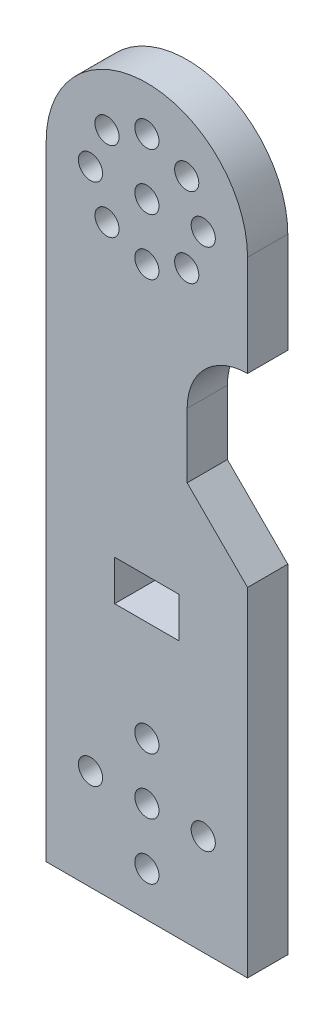
ISO-10303-21;
HEADER;
FILE_DESCRIPTION(('STEP AP214'),'2;1');
FILE_NAME('part.step','',(''),(''),'','','');
FILE_SCHEMA(('AUTOMOTIVE_DESIGN { 1 0 10303 214 1 1 1 1 }'));
ENDSEC;
DATA;
#1=APPLICATION_CONTEXT('core data for automotive mechanical design processes');
#2=APPLICATION_PROTOCOL_DEFINITION('international standard','automotive_design',2000,#1);
#3=PRODUCT_CONTEXT('',#1,'mechanical');
#4=PRODUCT('Part','Part','',(#3));
#5=PRODUCT_RELATED_PRODUCT_CATEGORY('part','',(#4));
#6=PRODUCT_DEFINITION_FORMATION('','',#4);
#7=PRODUCT_DEFINITION_CONTEXT('part definition',#1,'design');
#8=PRODUCT_DEFINITION('design','',#6,#7);
#9=PRODUCT_DEFINITION_SHAPE('','',#8);
#10=(LENGTH_UNIT() NAMED_UNIT(*) SI_UNIT(.MILLI.,.METRE.));
#11=(NAMED_UNIT(*) PLANE_ANGLE_UNIT() SI_UNIT($,.RADIAN.));
#12=(NAMED_UNIT(*) SI_UNIT($,.STERADIAN.) SOLID_ANGLE_UNIT());
#13=UNCERTAINTY_MEASURE_WITH_UNIT(LENGTH_MEASURE(1.E-05),#10,'distance_accuracy_value','');
#14=(GEOMETRIC_REPRESENTATION_CONTEXT(3) GLOBAL_UNCERTAINTY_ASSIGNED_CONTEXT((#13)) GLOBAL_UNIT_ASSIGNED_CONTEXT((#10,
#11,#12)) REPRESENTATION_CONTEXT('',''));
#15=CARTESIAN_POINT('',(0.,0.,0.));
#16=DIRECTION('',(0.,0.,1.));
#17=DIRECTION('',(1.,0.,0.));
#18=AXIS2_PLACEMENT_3D('',#15,#16,#17);
#19=CARTESIAN_POINT('',(12.5,0.,5.));
#20=DIRECTION('',(1.,0.,0.));
#21=DIRECTION('',(0.,1.,0.));
#22=AXIS2_PLACEMENT_3D('',#19,#20,#21);
#23=PLANE('',#22);
#24=DIRECTION('',(0.,0.,1.));
#25=VECTOR('',#24,1.);
#26=CARTESIAN_POINT('',(12.5,-12.5,-5.));
#27=LINE('',#26,#25);
#28=CARTESIAN_POINT('',(12.5,-12.5,0.));
#29=VERTEX_POINT('',#28);
#30=CARTESIAN_POINT('',(12.5,-12.5,5.));
#31=VERTEX_POINT('',#30);
#32=EDGE_CURVE('E146',#29,#31,#27,.T.);
#33=ORIENTED_EDGE('',*,*,#32,.F.);
#34=DIRECTION('',(0.,-1.,0.));
#35=VECTOR('',#34,1.);
#36=CARTESIAN_POINT('',(12.5,0.,0.));
#37=LINE('',#36,#35);
#38=CARTESIAN_POINT('',(12.5,0.,0.));
#39=VERTEX_POINT('',#38);
#40=EDGE_CURVE('E196',#39,#29,#37,.T.);
#41=ORIENTED_EDGE('',*,*,#40,.F.);
#42=DIRECTION('',(0.,0.,-1.));
#43=VECTOR('',#42,1.);
#44=CARTESIAN_POINT('',(12.5,0.,5.));
#45=LINE('',#44,#43);
#46=CARTESIAN_POINT('',(12.5,0.,5.));
#47=VERTEX_POINT('',#46);
#48=EDGE_CURVE('E216',#47,#39,#45,.T.);
#49=ORIENTED_EDGE('',*,*,#48,.F.);
#50=DIRECTION('',(0.,-1.,0.));
#51=VECTOR('',#50,1.);
#52=CARTESIAN_POINT('',(12.5,0.,5.));
#53=LINE('',#52,#51);
#54=EDGE_CURVE('E152',#47,#31,#53,.T.);
#55=ORIENTED_EDGE('',*,*,#54,.T.);
#56=EDGE_LOOP('',(#33,#41,#49,#55));
#57=FACE_BOUND('',#56,.T.);
#58=ADVANCED_FACE('F37',(#57),#23,.T.);
#59=CARTESIAN_POINT('',(0.,0.,5.));
#60=DIRECTION('',(0.,0.,1.));
#61=DIRECTION('',(1.,0.,0.));
#62=AXIS2_PLACEMENT_3D('',#59,#60,#61);
#63=PLANE('',#62);
#64=DIRECTION('',(0.707106781186549,-0.707106781186546,0.));
#65=VECTOR('',#64,1.);
#66=CARTESIAN_POINT('',(5.,-28.,5.));
#67=LINE('',#66,#65);
#68=CARTESIAN_POINT('',(5.,-28.,5.));
#69=VERTEX_POINT('',#68);
#70=CARTESIAN_POINT('',(12.5,-35.5,5.));
#71=VERTEX_POINT('',#70);
#72=EDGE_CURVE('E127',#69,#71,#67,.T.);
#73=ORIENTED_EDGE('',*,*,#72,.F.);
#74=DIRECTION('',(0.,-1.,0.));
#75=VECTOR('',#74,1.);
#76=CARTESIAN_POINT('',(5.,-20.,5.));
#77=LINE('',#76,#75);
#78=CARTESIAN_POINT('',(5.,-20.,5.));
#79=VERTEX_POINT('',#78);
#80=EDGE_CURVE('E137',#79,#69,#77,.T.);
#81=ORIENTED_EDGE('',*,*,#80,.F.);
#82=CARTESIAN_POINT('',(12.5,-20.,5.));
#83=DIRECTION('',(0.,0.,1.));
#84=DIRECTION('',(1.,0.,0.));
#85=AXIS2_PLACEMENT_3D('',#82,#83,#84);
#86=CIRCLE('',#85,7.5);
#87=EDGE_CURVE('E249',#31,#79,#86,.T.);
#88=ORIENTED_EDGE('',*,*,#87,.F.);
#89=ORIENTED_EDGE('',*,*,#54,.F.);
#90=CARTESIAN_POINT('',(0.,0.,5.));
#91=DIRECTION('',(0.,0.,1.));
#92=DIRECTION('',(1.,0.,0.));
#93=AXIS2_PLACEMENT_3D('',#90,#91,#92);
#94=CIRCLE('',#93,12.5);
#95=CARTESIAN_POINT('',(-12.5,0.,5.));
#96=VERTEX_POINT('',#95);
#97=EDGE_CURVE('E156',#47,#96,#94,.T.);
#98=ORIENTED_EDGE('',*,*,#97,.T.);
#99=DIRECTION('',(0.,-1.,0.));
#100=VECTOR('',#99,1.);
#101=CARTESIAN_POINT('',(-12.5,0.,5.));
#102=LINE('',#101,#100);
#103=CARTESIAN_POINT('',(-12.5,-77.5,5.));
#104=VERTEX_POINT('',#103);
#105=EDGE_CURVE('E164',#96,#104,#102,.T.);
#106=ORIENTED_EDGE('',*,*,#105,.T.);
#107=DIRECTION('',(1.,0.,0.));
#108=VECTOR('',#107,1.);
#109=CARTESIAN_POINT('',(0.,-77.5,5.));
#110=LINE('',#109,#108);
#111=CARTESIAN_POINT('',(12.5,-77.5,5.));
#112=VERTEX_POINT('',#111);
#113=EDGE_CURVE('E150',#104,#112,#110,.T.);
#114=ORIENTED_EDGE('',*,*,#113,.T.);
#115=EDGE_CURVE('E143',#71,#112,#53,.T.);
#116=ORIENTED_EDGE('',*,*,#115,.F.);
#117=EDGE_LOOP('',(#73,#81,#88,#89,#98,#106,#114,#116));
#118=FACE_BOUND('',#117,.T.);
#119=CARTESIAN_POINT('',(0.,-72.,5.));
#120=DIRECTION('',(0.,0.,-1.));
#121=DIRECTION('',(-1.,0.,0.));
#122=AXIS2_PLACEMENT_3D('',#119,#120,#121);
#123=CIRCLE('',#122,1.5);
#124=CARTESIAN_POINT('',(-1.5,-72.,5.));
#125=VERTEX_POINT('',#124);
#126=EDGE_CURVE('E234',#125,#125,#123,.T.);
#127=ORIENTED_EDGE('',*,*,#126,.T.);
#128=EDGE_LOOP('',(#127));
#129=FACE_BOUND('',#128,.T.);
#130=CARTESIAN_POINT('',(-7.,-65.,5.));
#131=DIRECTION('',(0.,0.,-1.));
#132=DIRECTION('',(-1.,0.,0.));
#133=AXIS2_PLACEMENT_3D('',#130,#131,#132);
#134=CIRCLE('',#133,1.50000000000001);
#135=CARTESIAN_POINT('',(-8.50000000000001,-65.,5.));
#136=VERTEX_POINT('',#135);
#137=EDGE_CURVE('E269',#136,#136,#134,.T.);
#138=ORIENTED_EDGE('',*,*,#137,.T.);
#139=EDGE_LOOP('',(#138));
#140=FACE_BOUND('',#139,.T.);
#141=CARTESIAN_POINT('',(7.,-65.,5.));
#142=DIRECTION('',(0.,0.,-1.));
#143=DIRECTION('',(-1.,0.,0.));
#144=AXIS2_PLACEMENT_3D('',#141,#142,#143);
#145=CIRCLE('',#144,1.5);
#146=CARTESIAN_POINT('',(5.5,-65.,5.));
#147=VERTEX_POINT('',#146);
#148=EDGE_CURVE('E279',#147,#147,#145,.T.);
#149=ORIENTED_EDGE('',*,*,#148,.T.);
#150=EDGE_LOOP('',(#149));
#151=FACE_BOUND('',#150,.T.);
#152=DIRECTION('',(0.,1.,0.));
#153=VECTOR('',#152,1.);
#154=CARTESIAN_POINT('',(4.,-40.5000000000002,5.));
#155=LINE('',#154,#153);
#156=CARTESIAN_POINT('',(4.,-45.5000000000002,5.));
#157=VERTEX_POINT('',#156);
#158=CARTESIAN_POINT('',(4.,-40.5000000000002,5.));
#159=VERTEX_POINT('',#158);
#160=EDGE_CURVE('E60',#157,#159,#155,.T.);
#161=ORIENTED_EDGE('',*,*,#160,.F.);
#162=DIRECTION('',(1.,0.,0.));
#163=VECTOR('',#162,1.);
#164=CARTESIAN_POINT('',(-4.,-45.5000000000002,5.));
#165=LINE('',#164,#163);
#166=CARTESIAN_POINT('',(-4.,-45.5000000000002,5.));
#167=VERTEX_POINT('',#166);
#168=EDGE_CURVE('E294',#167,#157,#165,.T.);
#169=ORIENTED_EDGE('',*,*,#168,.F.);
#170=DIRECTION('',(0.,-1.,0.));
#171=VECTOR('',#170,1.);
#172=CARTESIAN_POINT('',(-4.,-40.5000000000002,5.));
#173=LINE('',#172,#171);
#174=CARTESIAN_POINT('',(-4.,-40.5000000000002,5.));
#175=VERTEX_POINT('',#174);
#176=EDGE_CURVE('E291',#175,#167,#173,.T.);
#177=ORIENTED_EDGE('',*,*,#176,.F.);
#178=DIRECTION('',(-1.,0.,0.));
#179=VECTOR('',#178,1.);
#180=CARTESIAN_POINT('',(-4.,-40.5000000000002,5.));
#181=LINE('',#180,#179);
#182=EDGE_CURVE('E288',#159,#175,#181,.T.);
#183=ORIENTED_EDGE('',*,*,#182,.F.);
#184=EDGE_LOOP('',(#161,#169,#177,#183));
#185=FACE_BOUND('',#184,.T.);
#186=CARTESIAN_POINT('',(0.,0.,5.));
#187=DIRECTION('',(0.,0.,1.));
#188=DIRECTION('',(1.,0.,0.));
#189=AXIS2_PLACEMENT_3D('',#186,#187,#188);
#190=CIRCLE('',#189,1.5);
#191=CARTESIAN_POINT('',(1.5,0.,5.));
#192=VERTEX_POINT('',#191);
#193=EDGE_CURVE('E208',#192,#192,#190,.T.);
#194=ORIENTED_EDGE('',*,*,#193,.F.);
#195=EDGE_LOOP('',(#194));
#196=FACE_BOUND('',#195,.T.);
#197=CARTESIAN_POINT('',(0.,7.,5.));
#198=DIRECTION('',(0.,0.,1.));
#199=DIRECTION('',(1.,0.,0.));
#200=AXIS2_PLACEMENT_3D('',#197,#198,#199);
#201=CIRCLE('',#200,1.5);
#202=CARTESIAN_POINT('',(1.5,7.,5.));
#203=VERTEX_POINT('',#202);
#204=EDGE_CURVE('E306',#203,#203,#201,.T.);
#205=ORIENTED_EDGE('',*,*,#204,.F.);
#206=EDGE_LOOP('',(#205));
#207=FACE_BOUND('',#206,.T.);
#208=CARTESIAN_POINT('',(4.94974746830584,4.94974746830582,5.));
#209=DIRECTION('',(0.,0.,1.));
#210=DIRECTION('',(1.,0.,0.));
#211=AXIS2_PLACEMENT_3D('',#208,#209,#210);
#212=CIRCLE('',#211,1.5);
#213=CARTESIAN_POINT('',(6.44974746830584,4.94974746830582,5.));
#214=VERTEX_POINT('',#213);
#215=EDGE_CURVE('E309',#214,#214,#212,.T.);
#216=ORIENTED_EDGE('',*,*,#215,.F.);
#217=EDGE_LOOP('',(#216));
#218=FACE_BOUND('',#217,.T.);
#219=CARTESIAN_POINT('',(7.0000000000002,1.97666086873723E-13,5.));
#220=DIRECTION('',(0.,0.,1.));
#221=DIRECTION('',(1.,0.,0.));
#222=AXIS2_PLACEMENT_3D('',#219,#220,#221);
#223=CIRCLE('',#222,1.50000000000015);
#224=CARTESIAN_POINT('',(8.50000000000035,1.97666086873723E-13,5.));
#225=VERTEX_POINT('',#224);
#226=EDGE_CURVE('E312',#225,#225,#223,.T.);
#227=ORIENTED_EDGE('',*,*,#226,.F.);
#228=EDGE_LOOP('',(#227));
#229=FACE_BOUND('',#228,.T.);
#230=CARTESIAN_POINT('',(4.94974746830617,-4.94974746830569,5.));
#231=DIRECTION('',(0.,0.,1.));
#232=DIRECTION('',(1.,0.,0.));
#233=AXIS2_PLACEMENT_3D('',#230,#231,#232);
#234=CIRCLE('',#233,1.50000000000032);
#235=CARTESIAN_POINT('',(6.44974746830649,-4.94974746830569,5.));
#236=VERTEX_POINT('',#235);
#237=EDGE_CURVE('E315',#236,#236,#234,.T.);
#238=ORIENTED_EDGE('',*,*,#237,.F.);
#239=EDGE_LOOP('',(#238));
#240=FACE_BOUND('',#239,.T.);
#241=CARTESIAN_POINT('',(3.95332173747447E-13,-7.,5.));
#242=DIRECTION('',(0.,0.,1.));
#243=DIRECTION('',(1.,0.,0.));
#244=AXIS2_PLACEMENT_3D('',#241,#242,#243);
#245=CIRCLE('',#244,1.50000000000042);
#246=CARTESIAN_POINT('',(1.50000000000082,-7.,5.));
#247=VERTEX_POINT('',#246);
#248=EDGE_CURVE('E318',#247,#247,#245,.T.);
#249=ORIENTED_EDGE('',*,*,#248,.F.);
#250=EDGE_LOOP('',(#249));
#251=FACE_BOUND('',#250,.T.);
#252=CARTESIAN_POINT('',(-4.9497474683055,-4.94974746830597,5.));
#253=DIRECTION('',(0.,0.,1.));
#254=DIRECTION('',(1.,0.,0.));
#255=AXIS2_PLACEMENT_3D('',#252,#253,#254);
#256=CIRCLE('',#255,1.50000000000042);
#257=CARTESIAN_POINT('',(-3.44974746830507,-4.94974746830597,5.));
#258=VERTEX_POINT('',#257);
#259=EDGE_CURVE('E321',#258,#258,#256,.T.);
#260=ORIENTED_EDGE('',*,*,#259,.F.);
#261=EDGE_LOOP('',(#260));
#262=FACE_BOUND('',#261,.T.);
#263=CARTESIAN_POINT('',(-6.9999999999998,-1.98523339633126E-13,5.));
#264=DIRECTION('',(0.,0.,1.));
#265=DIRECTION('',(1.,0.,0.));
#266=AXIS2_PLACEMENT_3D('',#263,#264,#265);
#267=CIRCLE('',#266,1.50000000000032);
#268=CARTESIAN_POINT('',(-5.49999999999948,-1.98523339633126E-13,5.));
#269=VERTEX_POINT('',#268);
#270=EDGE_CURVE('E158',#269,#269,#267,.T.);
#271=ORIENTED_EDGE('',*,*,#270,.F.);
#272=EDGE_LOOP('',(#271));
#273=FACE_BOUND('',#272,.T.);
#274=CARTESIAN_POINT('',(-4.94974746830577,4.94974746830589,5.));
#275=DIRECTION('',(0.,0.,1.));
#276=DIRECTION('',(1.,0.,0.));
#277=AXIS2_PLACEMENT_3D('',#274,#275,#276);
#278=CIRCLE('',#277,1.5);
#279=CARTESIAN_POINT('',(-3.44974746830577,4.94974746830589,5.));
#280=VERTEX_POINT('',#279);
#281=EDGE_CURVE('E153',#280,#280,#278,.T.);
#282=ORIENTED_EDGE('',*,*,#281,.F.);
#283=EDGE_LOOP('',(#282));
#284=FACE_BOUND('',#283,.T.);
#285=CARTESIAN_POINT('',(0.,-65.,5.));
#286=DIRECTION('',(0.,0.,1.));
#287=DIRECTION('',(1.,0.,0.));
#288=AXIS2_PLACEMENT_3D('',#285,#286,#287);
#289=CIRCLE('',#288,1.5);
#290=CARTESIAN_POINT('',(1.50000000000001,-65.,5.));
#291=VERTEX_POINT('',#290);
#292=EDGE_CURVE('E281',#291,#291,#289,.T.);
#293=ORIENTED_EDGE('',*,*,#292,.F.);
#294=EDGE_LOOP('',(#293));
#295=FACE_BOUND('',#294,.T.);
#296=CARTESIAN_POINT('',(0.,-58.,5.));
#297=DIRECTION('',(0.,0.,1.));
#298=DIRECTION('',(1.,0.,0.));
#299=AXIS2_PLACEMENT_3D('',#296,#297,#298);
#300=CIRCLE('',#299,1.5);
#301=CARTESIAN_POINT('',(1.5,-58.,5.));
#302=VERTEX_POINT('',#301);
#303=EDGE_CURVE('E272',#302,#302,#300,.T.);
#304=ORIENTED_EDGE('',*,*,#303,.F.);
#305=EDGE_LOOP('',(#304));
#306=FACE_BOUND('',#305,.T.);
#307=ADVANCED_FACE('F147',(#118,#129,#140,#151,#185,#196,#207,#218,#229,#240,#251,#262,#273,
#284,#295,#306),#63,.T.);
#308=CARTESIAN_POINT('',(0.,0.,0.));
#309=DIRECTION('',(0.,0.,1.));
#310=DIRECTION('',(1.,0.,0.));
#311=AXIS2_PLACEMENT_3D('',#308,#309,#310);
#312=PLANE('',#311);
#313=CARTESIAN_POINT('',(0.,-72.,0.));
#314=DIRECTION('',(0.,0.,1.));
#315=DIRECTION('',(1.,0.,0.));
#316=AXIS2_PLACEMENT_3D('',#313,#314,#315);
#317=CIRCLE('',#316,1.5);
#318=CARTESIAN_POINT('',(1.5,-72.,0.));
#319=VERTEX_POINT('',#318);
#320=EDGE_CURVE('E243',#319,#319,#317,.F.);
#321=ORIENTED_EDGE('',*,*,#320,.F.);
#322=EDGE_LOOP('',(#321));
#323=FACE_BOUND('',#322,.T.);
#324=CARTESIAN_POINT('',(-7.,-65.,0.));
#325=DIRECTION('',(0.,0.,1.));
#326=DIRECTION('',(1.,0.,0.));
#327=AXIS2_PLACEMENT_3D('',#324,#325,#326);
#328=CIRCLE('',#327,1.50000000000001);
#329=CARTESIAN_POINT('',(-5.49999999999999,-65.,0.));
#330=VERTEX_POINT('',#329);
#331=EDGE_CURVE('E240',#330,#330,#328,.F.);
#332=ORIENTED_EDGE('',*,*,#331,.F.);
#333=EDGE_LOOP('',(#332));
#334=FACE_BOUND('',#333,.T.);
#335=CARTESIAN_POINT('',(0.,-65.,0.));
#336=DIRECTION('',(0.,0.,1.));
#337=DIRECTION('',(1.,0.,0.));
#338=AXIS2_PLACEMENT_3D('',#335,#336,#337);
#339=CIRCLE('',#338,1.5);
#340=CARTESIAN_POINT('',(1.50000000000001,-65.,0.));
#341=VERTEX_POINT('',#340);
#342=EDGE_CURVE('E233',#341,#341,#339,.T.);
#343=ORIENTED_EDGE('',*,*,#342,.T.);
#344=EDGE_LOOP('',(#343));
#345=FACE_BOUND('',#344,.T.);
#346=CARTESIAN_POINT('',(7.,-65.,0.));
#347=DIRECTION('',(0.,0.,1.));
#348=DIRECTION('',(1.,0.,0.));
#349=AXIS2_PLACEMENT_3D('',#346,#347,#348);
#350=CIRCLE('',#349,1.5);
#351=CARTESIAN_POINT('',(8.49999999999999,-65.,0.));
#352=VERTEX_POINT('',#351);
#353=EDGE_CURVE('E230',#352,#352,#350,.F.);
#354=ORIENTED_EDGE('',*,*,#353,.F.);
#355=EDGE_LOOP('',(#354));
#356=FACE_BOUND('',#355,.T.);
#357=DIRECTION('',(1.,0.,0.));
#358=VECTOR('',#357,1.);
#359=CARTESIAN_POINT('',(0.,-45.5000000000002,0.));
#360=LINE('',#359,#358);
#361=CARTESIAN_POINT('',(-4.,-45.5000000000002,0.));
#362=VERTEX_POINT('',#361);
#363=CARTESIAN_POINT('',(4.,-45.5000000000002,0.));
#364=VERTEX_POINT('',#363);
#365=EDGE_CURVE('E224',#362,#364,#360,.T.);
#366=ORIENTED_EDGE('',*,*,#365,.T.);
#367=DIRECTION('',(0.,1.,0.));
#368=VECTOR('',#367,1.);
#369=CARTESIAN_POINT('',(4.,0.,0.));
#370=LINE('',#369,#368);
#371=CARTESIAN_POINT('',(4.,-40.5000000000002,0.));
#372=VERTEX_POINT('',#371);
#373=EDGE_CURVE('E227',#364,#372,#370,.T.);
#374=ORIENTED_EDGE('',*,*,#373,.T.);
#375=DIRECTION('',(-1.,0.,0.));
#376=VECTOR('',#375,1.);
#377=CARTESIAN_POINT('',(0.,-40.5000000000002,0.));
#378=LINE('',#377,#376);
#379=CARTESIAN_POINT('',(-4.,-40.5000000000002,0.));
#380=VERTEX_POINT('',#379);
#381=EDGE_CURVE('E218',#372,#380,#378,.T.);
#382=ORIENTED_EDGE('',*,*,#381,.T.);
#383=DIRECTION('',(0.,-1.,0.));
#384=VECTOR('',#383,1.);
#385=CARTESIAN_POINT('',(-4.,0.,0.));
#386=LINE('',#385,#384);
#387=EDGE_CURVE('E221',#380,#362,#386,.T.);
#388=ORIENTED_EDGE('',*,*,#387,.T.);
#389=EDGE_LOOP('',(#366,#374,#382,#388));
#390=FACE_BOUND('',#389,.T.);
#391=CARTESIAN_POINT('',(0.,0.,0.));
#392=DIRECTION('',(0.,0.,1.));
#393=DIRECTION('',(1.,0.,0.));
#394=AXIS2_PLACEMENT_3D('',#391,#392,#393);
#395=CIRCLE('',#394,1.5);
#396=CARTESIAN_POINT('',(1.5,0.,0.));
#397=VERTEX_POINT('',#396);
#398=EDGE_CURVE('E168',#397,#397,#395,.T.);
#399=ORIENTED_EDGE('',*,*,#398,.T.);
#400=EDGE_LOOP('',(#399));
#401=FACE_BOUND('',#400,.T.);
#402=CARTESIAN_POINT('',(0.,7.,0.));
#403=DIRECTION('',(0.,0.,1.));
#404=DIRECTION('',(1.,0.,0.));
#405=AXIS2_PLACEMENT_3D('',#402,#403,#404);
#406=CIRCLE('',#405,1.5);
#407=CARTESIAN_POINT('',(1.5,7.,0.));
#408=VERTEX_POINT('',#407);
#409=EDGE_CURVE('E171',#408,#408,#406,.T.);
#410=ORIENTED_EDGE('',*,*,#409,.T.);
#411=EDGE_LOOP('',(#410));
#412=FACE_BOUND('',#411,.T.);
#413=CARTESIAN_POINT('',(4.94974746830584,4.94974746830582,0.));
#414=DIRECTION('',(0.,0.,1.));
#415=DIRECTION('',(1.,0.,0.));
#416=AXIS2_PLACEMENT_3D('',#413,#414,#415);
#417=CIRCLE('',#416,1.5);
#418=CARTESIAN_POINT('',(6.44974746830584,4.94974746830582,0.));
#419=VERTEX_POINT('',#418);
#420=EDGE_CURVE('E175',#419,#419,#417,.T.);
#421=ORIENTED_EDGE('',*,*,#420,.T.);
#422=EDGE_LOOP('',(#421));
#423=FACE_BOUND('',#422,.T.);
#424=CARTESIAN_POINT('',(7.0000000000002,1.97666086873723E-13,0.));
#425=DIRECTION('',(0.,0.,1.));
#426=DIRECTION('',(1.,0.,0.));
#427=AXIS2_PLACEMENT_3D('',#424,#425,#426);
#428=CIRCLE('',#427,1.50000000000015);
#429=CARTESIAN_POINT('',(8.50000000000035,1.97666086873723E-13,0.));
#430=VERTEX_POINT('',#429);
#431=EDGE_CURVE('E178',#430,#430,#428,.T.);
#432=ORIENTED_EDGE('',*,*,#431,.T.);
#433=EDGE_LOOP('',(#432));
#434=FACE_BOUND('',#433,.T.);
#435=CARTESIAN_POINT('',(4.94974746830617,-4.94974746830569,0.));
#436=DIRECTION('',(0.,0.,1.));
#437=DIRECTION('',(1.,0.,0.));
#438=AXIS2_PLACEMENT_3D('',#435,#436,#437);
#439=CIRCLE('',#438,1.50000000000032);
#440=CARTESIAN_POINT('',(6.44974746830649,-4.94974746830569,0.));
#441=VERTEX_POINT('',#440);
#442=EDGE_CURVE('E181',#441,#441,#439,.T.);
#443=ORIENTED_EDGE('',*,*,#442,.T.);
#444=EDGE_LOOP('',(#443));
#445=FACE_BOUND('',#444,.T.);
#446=CARTESIAN_POINT('',(3.95332173747447E-13,-7.,0.));
#447=DIRECTION('',(0.,0.,1.));
#448=DIRECTION('',(1.,0.,0.));
#449=AXIS2_PLACEMENT_3D('',#446,#447,#448);
#450=CIRCLE('',#449,1.50000000000042);
#451=CARTESIAN_POINT('',(1.50000000000082,-7.,0.));
#452=VERTEX_POINT('',#451);
#453=EDGE_CURVE('E184',#452,#452,#450,.T.);
#454=ORIENTED_EDGE('',*,*,#453,.T.);
#455=EDGE_LOOP('',(#454));
#456=FACE_BOUND('',#455,.T.);
#457=CARTESIAN_POINT('',(-4.9497474683055,-4.94974746830597,0.));
#458=DIRECTION('',(0.,0.,1.));
#459=DIRECTION('',(1.,0.,0.));
#460=AXIS2_PLACEMENT_3D('',#457,#458,#459);
#461=CIRCLE('',#460,1.50000000000042);
#462=CARTESIAN_POINT('',(-3.44974746830507,-4.94974746830597,0.));
#463=VERTEX_POINT('',#462);
#464=EDGE_CURVE('E187',#463,#463,#461,.T.);
#465=ORIENTED_EDGE('',*,*,#464,.T.);
#466=EDGE_LOOP('',(#465));
#467=FACE_BOUND('',#466,.T.);
#468=CARTESIAN_POINT('',(-6.9999999999998,-1.98523339633126E-13,0.));
#469=DIRECTION('',(0.,0.,1.));
#470=DIRECTION('',(1.,0.,0.));
#471=AXIS2_PLACEMENT_3D('',#468,#469,#470);
#472=CIRCLE('',#471,1.50000000000032);
#473=CARTESIAN_POINT('',(-5.49999999999948,-1.98523339633126E-13,0.));
#474=VERTEX_POINT('',#473);
#475=EDGE_CURVE('E190',#474,#474,#472,.T.);
#476=ORIENTED_EDGE('',*,*,#475,.T.);
#477=EDGE_LOOP('',(#476));
#478=FACE_BOUND('',#477,.T.);
#479=CARTESIAN_POINT('',(-4.94974746830577,4.94974746830589,0.));
#480=DIRECTION('',(0.,0.,1.));
#481=DIRECTION('',(1.,0.,0.));
#482=AXIS2_PLACEMENT_3D('',#479,#480,#481);
#483=CIRCLE('',#482,1.5);
#484=CARTESIAN_POINT('',(-3.44974746830577,4.94974746830589,0.));
#485=VERTEX_POINT('',#484);
#486=EDGE_CURVE('E193',#485,#485,#483,.T.);
#487=ORIENTED_EDGE('',*,*,#486,.T.);
#488=EDGE_LOOP('',(#487));
#489=FACE_BOUND('',#488,.T.);
#490=DIRECTION('',(0.,-1.,0.));
#491=VECTOR('',#490,1.);
#492=CARTESIAN_POINT('',(5.,0.,0.));
#493=LINE('',#492,#491);
#494=CARTESIAN_POINT('',(5.,-20.,0.));
#495=VERTEX_POINT('',#494);
#496=CARTESIAN_POINT('',(5.,-28.,0.));
#497=VERTEX_POINT('',#496);
#498=EDGE_CURVE('E11',#495,#497,#493,.T.);
#499=ORIENTED_EDGE('',*,*,#498,.T.);
#500=DIRECTION('',(0.707106781186549,-0.707106781186546,0.));
#501=VECTOR('',#500,1.);
#502=CARTESIAN_POINT('',(-11.5,-11.5000000000001,0.));
#503=LINE('',#502,#501);
#504=CARTESIAN_POINT('',(12.5,-35.5,0.));
#505=VERTEX_POINT('',#504);
#506=EDGE_CURVE('E268',#497,#505,#503,.T.);
#507=ORIENTED_EDGE('',*,*,#506,.T.);
#508=CARTESIAN_POINT('',(12.5,-77.5,0.));
#509=VERTEX_POINT('',#508);
#510=EDGE_CURVE('E145',#505,#509,#37,.T.);
#511=ORIENTED_EDGE('',*,*,#510,.T.);
#512=DIRECTION('',(1.,0.,0.));
#513=VECTOR('',#512,1.);
#514=CARTESIAN_POINT('',(0.,-77.5,0.));
#515=LINE('',#514,#513);
#516=CARTESIAN_POINT('',(-12.5,-77.5,0.));
#517=VERTEX_POINT('',#516);
#518=EDGE_CURVE('E205',#517,#509,#515,.T.);
#519=ORIENTED_EDGE('',*,*,#518,.F.);
#520=DIRECTION('',(0.,-1.,0.));
#521=VECTOR('',#520,1.);
#522=CARTESIAN_POINT('',(-12.5,0.,0.));
#523=LINE('',#522,#521);
#524=CARTESIAN_POINT('',(-12.5,0.,0.));
#525=VERTEX_POINT('',#524);
#526=EDGE_CURVE('E202',#525,#517,#523,.T.);
#527=ORIENTED_EDGE('',*,*,#526,.F.);
#528=CARTESIAN_POINT('',(0.,0.,0.));
#529=DIRECTION('',(0.,0.,1.));
#530=DIRECTION('',(1.,0.,0.));
#531=AXIS2_PLACEMENT_3D('',#528,#529,#530);
#532=CIRCLE('',#531,12.5);
#533=EDGE_CURVE('E199',#39,#525,#532,.T.);
#534=ORIENTED_EDGE('',*,*,#533,.F.);
#535=ORIENTED_EDGE('',*,*,#40,.T.);
#536=CARTESIAN_POINT('',(12.5,-20.,0.));
#537=DIRECTION('',(0.,0.,1.));
#538=DIRECTION('',(1.,0.,0.));
#539=AXIS2_PLACEMENT_3D('',#536,#537,#538);
#540=CIRCLE('',#539,7.5);
#541=EDGE_CURVE('E52',#29,#495,#540,.T.);
#542=ORIENTED_EDGE('',*,*,#541,.T.);
#543=EDGE_LOOP('',(#499,#507,#511,#519,#527,#534,#535,#542));
#544=FACE_BOUND('',#543,.T.);
#545=CARTESIAN_POINT('',(0.,-58.,0.));
#546=DIRECTION('',(0.,0.,1.));
#547=DIRECTION('',(1.,0.,0.));
#548=AXIS2_PLACEMENT_3D('',#545,#546,#547);
#549=CIRCLE('',#548,1.5);
#550=CARTESIAN_POINT('',(1.5,-58.,0.));
#551=VERTEX_POINT('',#550);
#552=EDGE_CURVE('E237',#551,#551,#549,.T.);
#553=ORIENTED_EDGE('',*,*,#552,.T.);
#554=EDGE_LOOP('',(#553));
#555=FACE_BOUND('',#554,.T.);
#556=ADVANCED_FACE('F266',(#323,#334,#345,#356,#390,#401,#412,#423,#434,#445,#456,#467,#478,
#489,#544,#555),#312,.F.);
#557=DIRECTION('',(0.,0.,-1.));
#558=VECTOR('',#557,1.);
#559=CARTESIAN_POINT('',(12.5,-35.5,5.));
#560=LINE('',#559,#558);
#561=EDGE_CURVE('E45',#71,#505,#560,.T.);
#562=ORIENTED_EDGE('',*,*,#561,.F.);
#563=ORIENTED_EDGE('',*,*,#115,.T.);
#564=DIRECTION('',(0.,0.,-1.));
#565=VECTOR('',#564,1.);
#566=CARTESIAN_POINT('',(12.5,-77.5,5.));
#567=LINE('',#566,#565);
#568=EDGE_CURVE('E167',#112,#509,#567,.T.);
#569=ORIENTED_EDGE('',*,*,#568,.T.);
#570=ORIENTED_EDGE('',*,*,#510,.F.);
#571=EDGE_LOOP('',(#562,#563,#569,#570));
#572=FACE_BOUND('',#571,.T.);
#573=ADVANCED_FACE('F141',(#572),#23,.T.);
#574=CARTESIAN_POINT('',(0.,0.,5.));
#575=DIRECTION('',(0.,0.,-1.));
#576=DIRECTION('',(-1.,0.,0.));
#577=AXIS2_PLACEMENT_3D('',#574,#575,#576);
#578=CYLINDRICAL_SURFACE('',#577,12.5);
#579=ORIENTED_EDGE('',*,*,#533,.T.);
#580=DIRECTION('',(0.,0.,-1.));
#581=VECTOR('',#580,1.);
#582=CARTESIAN_POINT('',(-12.5,0.,5.));
#583=LINE('',#582,#581);
#584=EDGE_CURVE('E213',#96,#525,#583,.T.);
#585=ORIENTED_EDGE('',*,*,#584,.F.);
#586=ORIENTED_EDGE('',*,*,#97,.F.);
#587=ORIENTED_EDGE('',*,*,#48,.T.);
#588=EDGE_LOOP('',(#579,#585,#586,#587));
#589=FACE_BOUND('',#588,.T.);
#590=ADVANCED_FACE('F259',(#589),#578,.T.);
#591=CARTESIAN_POINT('',(-12.5,0.,5.));
#592=DIRECTION('',(1.,0.,0.));
#593=DIRECTION('',(0.,1.,0.));
#594=AXIS2_PLACEMENT_3D('',#591,#592,#593);
#595=PLANE('',#594);
#596=ORIENTED_EDGE('',*,*,#526,.T.);
#597=DIRECTION('',(0.,0.,-1.));
#598=VECTOR('',#597,1.);
#599=CARTESIAN_POINT('',(-12.5,-77.5,5.));
#600=LINE('',#599,#598);
#601=EDGE_CURVE('E210',#104,#517,#600,.T.);
#602=ORIENTED_EDGE('',*,*,#601,.F.);
#603=ORIENTED_EDGE('',*,*,#105,.F.);
#604=ORIENTED_EDGE('',*,*,#584,.T.);
#605=EDGE_LOOP('',(#596,#602,#603,#604));
#606=FACE_BOUND('',#605,.T.);
#607=ADVANCED_FACE('F262',(#606),#595,.F.);
#608=CARTESIAN_POINT('',(-4.94974746830577,4.94974746830589,5.));
#609=DIRECTION('',(0.,0.,-1.));
#610=DIRECTION('',(-1.,0.,0.));
#611=AXIS2_PLACEMENT_3D('',#608,#609,#610);
#612=CYLINDRICAL_SURFACE('',#611,1.5);
#613=ORIENTED_EDGE('',*,*,#281,.T.);
#614=EDGE_LOOP('',(#613));
#615=FACE_BOUND('',#614,.T.);
#616=ORIENTED_EDGE('',*,*,#486,.F.);
#617=EDGE_LOOP('',(#616));
#618=FACE_BOUND('',#617,.T.);
#619=ADVANCED_FACE('F362',(#615,#618),#612,.F.);
#620=CARTESIAN_POINT('',(-6.9999999999998,-1.98523339633126E-13,5.));
#621=DIRECTION('',(0.,0.,-1.));
#622=DIRECTION('',(-1.,0.,0.));
#623=AXIS2_PLACEMENT_3D('',#620,#621,#622);
#624=CYLINDRICAL_SURFACE('',#623,1.50000000000032);
#625=ORIENTED_EDGE('',*,*,#270,.T.);
#626=EDGE_LOOP('',(#625));
#627=FACE_BOUND('',#626,.T.);
#628=ORIENTED_EDGE('',*,*,#475,.F.);
#629=EDGE_LOOP('',(#628));
#630=FACE_BOUND('',#629,.T.);
#631=ADVANCED_FACE('F326',(#627,#630),#624,.F.);
#632=CARTESIAN_POINT('',(-4.9497474683055,-4.94974746830597,5.));
#633=DIRECTION('',(0.,0.,-1.));
#634=DIRECTION('',(-1.,0.,0.));
#635=AXIS2_PLACEMENT_3D('',#632,#633,#634);
#636=CYLINDRICAL_SURFACE('',#635,1.50000000000042);
#637=ORIENTED_EDGE('',*,*,#259,.T.);
#638=EDGE_LOOP('',(#637));
#639=FACE_BOUND('',#638,.T.);
#640=ORIENTED_EDGE('',*,*,#464,.F.);
#641=EDGE_LOOP('',(#640));
#642=FACE_BOUND('',#641,.T.);
#643=ADVANCED_FACE('F368',(#639,#642),#636,.F.);
#644=CARTESIAN_POINT('',(3.95332173747447E-13,-7.,5.));
#645=DIRECTION('',(0.,0.,-1.));
#646=DIRECTION('',(-1.,0.,0.));
#647=AXIS2_PLACEMENT_3D('',#644,#645,#646);
#648=CYLINDRICAL_SURFACE('',#647,1.50000000000042);
#649=ORIENTED_EDGE('',*,*,#248,.T.);
#650=EDGE_LOOP('',(#649));
#651=FACE_BOUND('',#650,.T.);
#652=ORIENTED_EDGE('',*,*,#453,.F.);
#653=EDGE_LOOP('',(#652));
#654=FACE_BOUND('',#653,.T.);
#655=ADVANCED_FACE('F371',(#651,#654),#648,.F.);
#656=CARTESIAN_POINT('',(4.94974746830617,-4.94974746830569,5.));
#657=DIRECTION('',(0.,0.,-1.));
#658=DIRECTION('',(-1.,0.,0.));
#659=AXIS2_PLACEMENT_3D('',#656,#657,#658);
#660=CYLINDRICAL_SURFACE('',#659,1.50000000000032);
#661=ORIENTED_EDGE('',*,*,#237,.T.);
#662=EDGE_LOOP('',(#661));
#663=FACE_BOUND('',#662,.T.);
#664=ORIENTED_EDGE('',*,*,#442,.F.);
#665=EDGE_LOOP('',(#664));
#666=FACE_BOUND('',#665,.T.);
#667=ADVANCED_FACE('F375',(#663,#666),#660,.F.);
#668=CARTESIAN_POINT('',(7.0000000000002,1.97666086873723E-13,5.));
#669=DIRECTION('',(0.,0.,-1.));
#670=DIRECTION('',(-1.,0.,0.));
#671=AXIS2_PLACEMENT_3D('',#668,#669,#670);
#672=CYLINDRICAL_SURFACE('',#671,1.50000000000015);
#673=ORIENTED_EDGE('',*,*,#226,.T.);
#674=EDGE_LOOP('',(#673));
#675=FACE_BOUND('',#674,.T.);
#676=ORIENTED_EDGE('',*,*,#431,.F.);
#677=EDGE_LOOP('',(#676));
#678=FACE_BOUND('',#677,.T.);
#679=ADVANCED_FACE('F379',(#675,#678),#672,.F.);
#680=CARTESIAN_POINT('',(4.94974746830584,4.94974746830582,5.));
#681=DIRECTION('',(0.,0.,-1.));
#682=DIRECTION('',(-1.,0.,0.));
#683=AXIS2_PLACEMENT_3D('',#680,#681,#682);
#684=CYLINDRICAL_SURFACE('',#683,1.5);
#685=ORIENTED_EDGE('',*,*,#215,.T.);
#686=EDGE_LOOP('',(#685));
#687=FACE_BOUND('',#686,.T.);
#688=ORIENTED_EDGE('',*,*,#420,.F.);
#689=EDGE_LOOP('',(#688));
#690=FACE_BOUND('',#689,.T.);
#691=ADVANCED_FACE('F383',(#687,#690),#684,.F.);
#692=CARTESIAN_POINT('',(0.,7.,5.));
#693=DIRECTION('',(0.,0.,-1.));
#694=DIRECTION('',(-1.,0.,0.));
#695=AXIS2_PLACEMENT_3D('',#692,#693,#694);
#696=CYLINDRICAL_SURFACE('',#695,1.5);
#697=ORIENTED_EDGE('',*,*,#204,.T.);
#698=EDGE_LOOP('',(#697));
#699=FACE_BOUND('',#698,.T.);
#700=ORIENTED_EDGE('',*,*,#409,.F.);
#701=EDGE_LOOP('',(#700));
#702=FACE_BOUND('',#701,.T.);
#703=ADVANCED_FACE('F386',(#699,#702),#696,.F.);
#704=CARTESIAN_POINT('',(0.,0.,5.));
#705=DIRECTION('',(0.,0.,-1.));
#706=DIRECTION('',(-1.,0.,0.));
#707=AXIS2_PLACEMENT_3D('',#704,#705,#706);
#708=CYLINDRICAL_SURFACE('',#707,1.5);
#709=ORIENTED_EDGE('',*,*,#193,.T.);
#710=EDGE_LOOP('',(#709));
#711=FACE_BOUND('',#710,.T.);
#712=ORIENTED_EDGE('',*,*,#398,.F.);
#713=EDGE_LOOP('',(#712));
#714=FACE_BOUND('',#713,.T.);
#715=ADVANCED_FACE('F39',(#711,#714),#708,.F.);
#716=CARTESIAN_POINT('',(0.,-77.5,5.));
#717=DIRECTION('',(0.,1.,0.));
#718=DIRECTION('',(0.,0.,1.));
#719=AXIS2_PLACEMENT_3D('',#716,#717,#718);
#720=PLANE('',#719);
#721=ORIENTED_EDGE('',*,*,#518,.T.);
#722=ORIENTED_EDGE('',*,*,#568,.F.);
#723=ORIENTED_EDGE('',*,*,#113,.F.);
#724=ORIENTED_EDGE('',*,*,#601,.T.);
#725=EDGE_LOOP('',(#721,#722,#723,#724));
#726=FACE_BOUND('',#725,.T.);
#727=ADVANCED_FACE('F264',(#726),#720,.F.);
#728=CARTESIAN_POINT('',(4.,-40.5000000000002,-5.));
#729=DIRECTION('',(1.,0.,0.));
#730=DIRECTION('',(0.,0.,-1.));
#731=AXIS2_PLACEMENT_3D('',#728,#729,#730);
#732=PLANE('',#731);
#733=DIRECTION('',(0.,0.,1.));
#734=VECTOR('',#733,1.);
#735=CARTESIAN_POINT('',(4.,-45.5000000000002,-5.));
#736=LINE('',#735,#734);
#737=EDGE_CURVE('E172',#364,#157,#736,.T.);
#738=ORIENTED_EDGE('',*,*,#737,.T.);
#739=ORIENTED_EDGE('',*,*,#160,.T.);
#740=DIRECTION('',(0.,0.,1.));
#741=VECTOR('',#740,1.);
#742=CARTESIAN_POINT('',(4.,-40.5000000000002,-5.));
#743=LINE('',#742,#741);
#744=EDGE_CURVE('E297',#372,#159,#743,.T.);
#745=ORIENTED_EDGE('',*,*,#744,.F.);
#746=ORIENTED_EDGE('',*,*,#373,.F.);
#747=EDGE_LOOP('',(#738,#739,#745,#746));
#748=FACE_BOUND('',#747,.T.);
#749=ADVANCED_FACE('F432',(#748),#732,.F.);
#750=CARTESIAN_POINT('',(-4.,-45.5000000000002,-5.));
#751=DIRECTION('',(0.,-1.,0.));
#752=DIRECTION('',(0.,0.,-1.));
#753=AXIS2_PLACEMENT_3D('',#750,#751,#752);
#754=PLANE('',#753);
#755=DIRECTION('',(0.,0.,1.));
#756=VECTOR('',#755,1.);
#757=CARTESIAN_POINT('',(-4.,-45.5000000000002,-5.));
#758=LINE('',#757,#756);
#759=EDGE_CURVE('E299',#362,#167,#758,.T.);
#760=ORIENTED_EDGE('',*,*,#759,.T.);
#761=ORIENTED_EDGE('',*,*,#168,.T.);
#762=ORIENTED_EDGE('',*,*,#737,.F.);
#763=ORIENTED_EDGE('',*,*,#365,.F.);
#764=EDGE_LOOP('',(#760,#761,#762,#763));
#765=FACE_BOUND('',#764,.T.);
#766=ADVANCED_FACE('F441',(#765),#754,.F.);
#767=CARTESIAN_POINT('',(-4.,-40.5000000000002,-5.));
#768=DIRECTION('',(-1.,0.,0.));
#769=DIRECTION('',(0.,0.,1.));
#770=AXIS2_PLACEMENT_3D('',#767,#768,#769);
#771=PLANE('',#770);
#772=DIRECTION('',(0.,0.,1.));
#773=VECTOR('',#772,1.);
#774=CARTESIAN_POINT('',(-4.,-40.5000000000002,-5.));
#775=LINE('',#774,#773);
#776=EDGE_CURVE('E301',#380,#175,#775,.T.);
#777=ORIENTED_EDGE('',*,*,#776,.T.);
#778=ORIENTED_EDGE('',*,*,#176,.T.);
#779=ORIENTED_EDGE('',*,*,#759,.F.);
#780=ORIENTED_EDGE('',*,*,#387,.F.);
#781=EDGE_LOOP('',(#777,#778,#779,#780));
#782=FACE_BOUND('',#781,.T.);
#783=ADVANCED_FACE('F501',(#782),#771,.F.);
#784=CARTESIAN_POINT('',(-4.,-40.5000000000002,-5.));
#785=DIRECTION('',(0.,1.,0.));
#786=DIRECTION('',(0.,0.,1.));
#787=AXIS2_PLACEMENT_3D('',#784,#785,#786);
#788=PLANE('',#787);
#789=ORIENTED_EDGE('',*,*,#744,.T.);
#790=ORIENTED_EDGE('',*,*,#182,.T.);
#791=ORIENTED_EDGE('',*,*,#776,.F.);
#792=ORIENTED_EDGE('',*,*,#381,.F.);
#793=EDGE_LOOP('',(#789,#790,#791,#792));
#794=FACE_BOUND('',#793,.T.);
#795=ADVANCED_FACE('F494',(#794),#788,.F.);
#796=CARTESIAN_POINT('',(7.,-65.,-5.));
#797=DIRECTION('',(0.,0.,1.));
#798=DIRECTION('',(1.,0.,0.));
#799=AXIS2_PLACEMENT_3D('',#796,#797,#798);
#800=CYLINDRICAL_SURFACE('',#799,1.5);
#801=ORIENTED_EDGE('',*,*,#148,.F.);
#802=EDGE_LOOP('',(#801));
#803=FACE_BOUND('',#802,.T.);
#804=ORIENTED_EDGE('',*,*,#353,.T.);
#805=EDGE_LOOP('',(#804));
#806=FACE_BOUND('',#805,.T.);
#807=ADVANCED_FACE('F491',(#803,#806),#800,.F.);
#808=CARTESIAN_POINT('',(0.,-65.,-5.));
#809=DIRECTION('',(0.,0.,1.));
#810=DIRECTION('',(1.,0.,0.));
#811=AXIS2_PLACEMENT_3D('',#808,#809,#810);
#812=CYLINDRICAL_SURFACE('',#811,1.5);
#813=ORIENTED_EDGE('',*,*,#292,.T.);
#814=EDGE_LOOP('',(#813));
#815=FACE_BOUND('',#814,.T.);
#816=ORIENTED_EDGE('',*,*,#342,.F.);
#817=EDGE_LOOP('',(#816));
#818=FACE_BOUND('',#817,.T.);
#819=ADVANCED_FACE('F342',(#815,#818),#812,.F.);
#820=CARTESIAN_POINT('',(0.,-58.,-5.));
#821=DIRECTION('',(0.,0.,1.));
#822=DIRECTION('',(1.,0.,0.));
#823=AXIS2_PLACEMENT_3D('',#820,#821,#822);
#824=CYLINDRICAL_SURFACE('',#823,1.5);
#825=ORIENTED_EDGE('',*,*,#303,.T.);
#826=EDGE_LOOP('',(#825));
#827=FACE_BOUND('',#826,.T.);
#828=ORIENTED_EDGE('',*,*,#552,.F.);
#829=EDGE_LOOP('',(#828));
#830=FACE_BOUND('',#829,.T.);
#831=ADVANCED_FACE('F338',(#827,#830),#824,.F.);
#832=CARTESIAN_POINT('',(-7.,-65.,-5.));
#833=DIRECTION('',(0.,0.,1.));
#834=DIRECTION('',(1.,0.,0.));
#835=AXIS2_PLACEMENT_3D('',#832,#833,#834);
#836=CYLINDRICAL_SURFACE('',#835,1.50000000000001);
#837=ORIENTED_EDGE('',*,*,#137,.F.);
#838=EDGE_LOOP('',(#837));
#839=FACE_BOUND('',#838,.T.);
#840=ORIENTED_EDGE('',*,*,#331,.T.);
#841=EDGE_LOOP('',(#840));
#842=FACE_BOUND('',#841,.T.);
#843=ADVANCED_FACE('F341',(#839,#842),#836,.F.);
#844=CARTESIAN_POINT('',(0.,-72.,-5.));
#845=DIRECTION('',(0.,0.,1.));
#846=DIRECTION('',(1.,0.,0.));
#847=AXIS2_PLACEMENT_3D('',#844,#845,#846);
#848=CYLINDRICAL_SURFACE('',#847,1.5);
#849=ORIENTED_EDGE('',*,*,#126,.F.);
#850=EDGE_LOOP('',(#849));
#851=FACE_BOUND('',#850,.T.);
#852=ORIENTED_EDGE('',*,*,#320,.T.);
#853=EDGE_LOOP('',(#852));
#854=FACE_BOUND('',#853,.T.);
#855=ADVANCED_FACE('F463',(#851,#854),#848,.F.);
#856=CARTESIAN_POINT('',(5.,-20.,-5.));
#857=DIRECTION('',(-1.,0.,0.));
#858=DIRECTION('',(0.,-1.,0.));
#859=AXIS2_PLACEMENT_3D('',#856,#857,#858);
#860=PLANE('',#859);
#861=DIRECTION('',(0.,0.,1.));
#862=VECTOR('',#861,1.);
#863=CARTESIAN_POINT('',(5.,-20.,-5.));
#864=LINE('',#863,#862);
#865=EDGE_CURVE('E253',#495,#79,#864,.T.);
#866=ORIENTED_EDGE('',*,*,#865,.T.);
#867=ORIENTED_EDGE('',*,*,#80,.T.);
#868=DIRECTION('',(0.,0.,1.));
#869=VECTOR('',#868,1.);
#870=CARTESIAN_POINT('',(5.,-28.,-5.));
#871=LINE('',#870,#869);
#872=EDGE_CURVE('E132',#497,#69,#871,.T.);
#873=ORIENTED_EDGE('',*,*,#872,.F.);
#874=ORIENTED_EDGE('',*,*,#498,.F.);
#875=EDGE_LOOP('',(#866,#867,#873,#874));
#876=FACE_BOUND('',#875,.T.);
#877=ADVANCED_FACE('F458',(#876),#860,.F.);
#878=CARTESIAN_POINT('',(5.,-28.,-5.));
#879=DIRECTION('',(-0.707106781186546,-0.707106781186549,0.));
#880=DIRECTION('',(0.707106781186549,-0.707106781186546,0.));
#881=AXIS2_PLACEMENT_3D('',#878,#879,#880);
#882=PLANE('',#881);
#883=ORIENTED_EDGE('',*,*,#872,.T.);
#884=ORIENTED_EDGE('',*,*,#72,.T.);
#885=ORIENTED_EDGE('',*,*,#561,.T.);
#886=ORIENTED_EDGE('',*,*,#506,.F.);
#887=EDGE_LOOP('',(#883,#884,#885,#886));
#888=FACE_BOUND('',#887,.T.);
#889=ADVANCED_FACE('F129',(#888),#882,.F.);
#890=CARTESIAN_POINT('',(12.5,-20.,-5.));
#891=DIRECTION('',(0.,0.,1.));
#892=DIRECTION('',(1.,0.,0.));
#893=AXIS2_PLACEMENT_3D('',#890,#891,#892);
#894=CYLINDRICAL_SURFACE('',#893,7.5);
#895=ORIENTED_EDGE('',*,*,#32,.T.);
#896=ORIENTED_EDGE('',*,*,#87,.T.);
#897=ORIENTED_EDGE('',*,*,#865,.F.);
#898=ORIENTED_EDGE('',*,*,#541,.F.);
#899=EDGE_LOOP('',(#895,#896,#897,#898));
#900=FACE_BOUND('',#899,.T.);
#901=ADVANCED_FACE('F248',(#900),#894,.F.);
#902=CLOSED_SHELL('',(#58,#307,#556,#573,#590,#607,#619,#631,#643,#655,#667,#679,#691,#703,#715,
#727,#749,#766,#783,#795,#807,#819,#831,#843,#855,#877,#889,#901));
#903=MANIFOLD_SOLID_BREP('B2',#902);
#904=ADVANCED_BREP_SHAPE_REPRESENTATION('',(#18,#903),#14);
#905=SHAPE_DEFINITION_REPRESENTATION(#9,#904);
ENDSEC;
END-ISO-10303-21;
